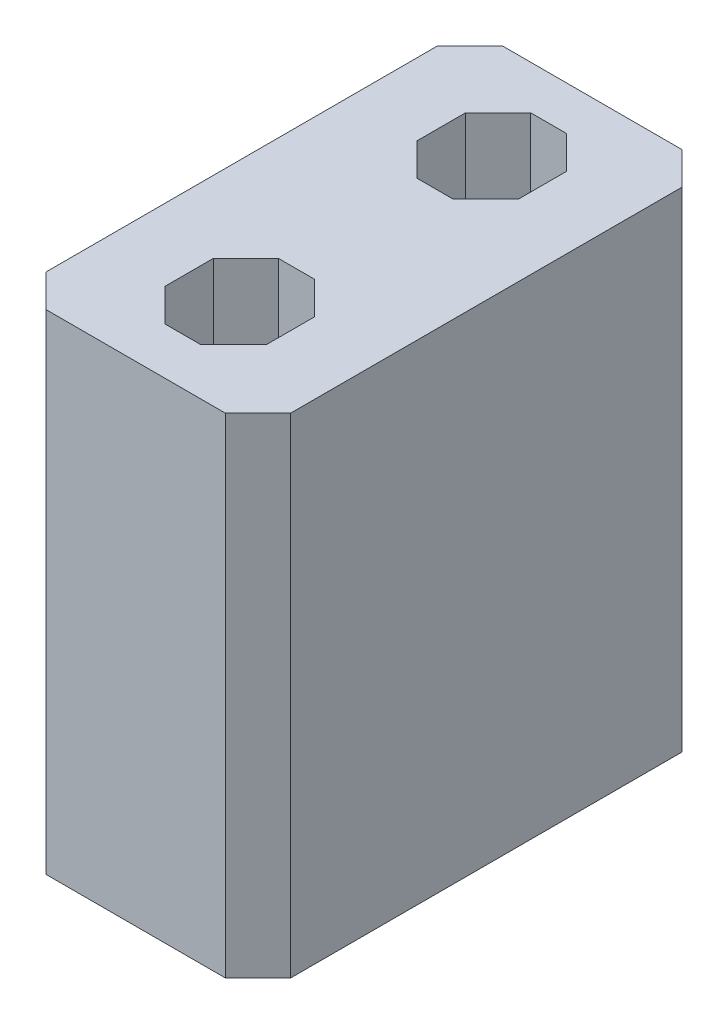
ISO-10303-21;
HEADER;
FILE_DESCRIPTION(('STEP AP214'),'2;1');
FILE_NAME('part.step','',(''),(''),'','','');
FILE_SCHEMA(('AUTOMOTIVE_DESIGN { 1 0 10303 214 1 1 1 1 }'));
ENDSEC;
DATA;
#1=APPLICATION_CONTEXT('core data for automotive mechanical design processes');
#2=APPLICATION_PROTOCOL_DEFINITION('international standard','automotive_design',2000,#1);
#3=PRODUCT_CONTEXT('',#1,'mechanical');
#4=PRODUCT('Part','Part','',(#3));
#5=PRODUCT_RELATED_PRODUCT_CATEGORY('part','',(#4));
#6=PRODUCT_DEFINITION_FORMATION('','',#4);
#7=PRODUCT_DEFINITION_CONTEXT('part definition',#1,'design');
#8=PRODUCT_DEFINITION('design','',#6,#7);
#9=PRODUCT_DEFINITION_SHAPE('','',#8);
#10=(LENGTH_UNIT() NAMED_UNIT(*) SI_UNIT(.MILLI.,.METRE.));
#11=(NAMED_UNIT(*) PLANE_ANGLE_UNIT() SI_UNIT($,.RADIAN.));
#12=(NAMED_UNIT(*) SI_UNIT($,.STERADIAN.) SOLID_ANGLE_UNIT());
#13=UNCERTAINTY_MEASURE_WITH_UNIT(LENGTH_MEASURE(1.E-05),#10,'distance_accuracy_value','');
#14=(GEOMETRIC_REPRESENTATION_CONTEXT(3) GLOBAL_UNCERTAINTY_ASSIGNED_CONTEXT((#13)) GLOBAL_UNIT_ASSIGNED_CONTEXT((#10,
#11,#12)) REPRESENTATION_CONTEXT('',''));
#15=CARTESIAN_POINT('',(0.,0.,0.));
#16=DIRECTION('',(0.,0.,1.));
#17=DIRECTION('',(1.,0.,0.));
#18=AXIS2_PLACEMENT_3D('',#15,#16,#17);
#19=CARTESIAN_POINT('',(0.,0.,0.));
#20=DIRECTION('',(0.,-1.,0.));
#21=DIRECTION('',(0.,0.,-1.));
#22=AXIS2_PLACEMENT_3D('',#19,#20,#21);
#23=PLANE('',#22);
#24=CARTESIAN_POINT('',(0.,0.,-8.));
#25=DIRECTION('',(0.,1.,0.));
#26=DIRECTION('',(0.,0.,1.));
#27=AXIS2_PLACEMENT_3D('',#24,#25,#26);
#28=CIRCLE('',#27,4.);
#29=CARTESIAN_POINT('',(0.,0.,-4.));
#30=VERTEX_POINT('',#29);
#31=EDGE_CURVE('E360',#30,#30,#28,.T.);
#32=ORIENTED_EDGE('',*,*,#31,.T.);
#33=EDGE_LOOP('',(#32));
#34=FACE_BOUND('',#33,.T.);
#35=DIRECTION('',(0.,0.,1.));
#36=VECTOR('',#35,1.);
#37=CARTESIAN_POINT('',(-7.51385015048993,0.,14.098387904848));
#38=LINE('',#37,#36);
#39=CARTESIAN_POINT('',(-7.51385015048993,0.,-11.901612095152));
#40=VERTEX_POINT('',#39);
#41=CARTESIAN_POINT('',(-7.51385015048993,0.,12.098387904848));
#42=VERTEX_POINT('',#41);
#43=EDGE_CURVE('E370',#40,#42,#38,.T.);
#44=ORIENTED_EDGE('',*,*,#43,.F.);
#45=DIRECTION('',(-0.707106781186548,0.,0.707106781186547));
#46=VECTOR('',#45,1.);
#47=CARTESIAN_POINT('',(-9.70773112282095,0.,-9.70773112282096));
#48=LINE('',#47,#46);
#49=CARTESIAN_POINT('',(-5.51385015048992,0.,-13.901612095152));
#50=VERTEX_POINT('',#49);
#51=EDGE_CURVE('E387',#40,#50,#48,.F.);
#52=ORIENTED_EDGE('',*,*,#51,.T.);
#53=DIRECTION('',(-1.,0.,0.));
#54=VECTOR('',#53,1.);
#55=CARTESIAN_POINT('',(-7.51385015048993,0.,-13.901612095152));
#56=LINE('',#55,#54);
#57=CARTESIAN_POINT('',(5.48614984951007,0.,-13.901612095152));
#58=VERTEX_POINT('',#57);
#59=EDGE_CURVE('E367',#58,#50,#56,.T.);
#60=ORIENTED_EDGE('',*,*,#59,.F.);
#61=DIRECTION('',(-0.707106781186547,0.,-0.707106781186548));
#62=VECTOR('',#61,1.);
#63=CARTESIAN_POINT('',(9.69388097233103,0.,-9.69388097233102));
#64=LINE('',#63,#62);
#65=CARTESIAN_POINT('',(7.48614984951007,0.,-11.901612095152));
#66=VERTEX_POINT('',#65);
#67=EDGE_CURVE('E385',#58,#66,#64,.F.);
#68=ORIENTED_EDGE('',*,*,#67,.T.);
#69=DIRECTION('',(0.,0.,-1.));
#70=VECTOR('',#69,1.);
#71=CARTESIAN_POINT('',(7.48614984951007,0.,14.098387904848));
#72=LINE('',#71,#70);
#73=CARTESIAN_POINT('',(7.48614984951007,0.,12.098387904848));
#74=VERTEX_POINT('',#73);
#75=EDGE_CURVE('E365',#74,#66,#72,.T.);
#76=ORIENTED_EDGE('',*,*,#75,.F.);
#77=DIRECTION('',(0.707106781186548,0.,-0.707106781186547));
#78=VECTOR('',#77,1.);
#79=CARTESIAN_POINT('',(9.79226887717904,0.,9.79226887717905));
#80=LINE('',#79,#78);
#81=CARTESIAN_POINT('',(5.48614984951007,0.,14.098387904848));
#82=VERTEX_POINT('',#81);
#83=EDGE_CURVE('E381',#74,#82,#80,.F.);
#84=ORIENTED_EDGE('',*,*,#83,.T.);
#85=DIRECTION('',(1.,0.,0.));
#86=VECTOR('',#85,1.);
#87=CARTESIAN_POINT('',(-7.51385015048993,0.,14.098387904848));
#88=LINE('',#87,#86);
#89=CARTESIAN_POINT('',(-5.51385015048992,0.,14.098387904848));
#90=VERTEX_POINT('',#89);
#91=EDGE_CURVE('E373',#90,#82,#88,.T.);
#92=ORIENTED_EDGE('',*,*,#91,.F.);
#93=DIRECTION('',(0.707106781186547,0.,0.707106781186548));
#94=VECTOR('',#93,1.);
#95=CARTESIAN_POINT('',(-9.80611902766897,0.,9.80611902766895));
#96=LINE('',#95,#94);
#97=EDGE_CURVE('E383',#90,#42,#96,.F.);
#98=ORIENTED_EDGE('',*,*,#97,.T.);
#99=EDGE_LOOP('',(#44,#52,#60,#68,#76,#84,#92,#98));
#100=FACE_BOUND('',#99,.T.);
#101=CARTESIAN_POINT('',(0.,0.,8.));
#102=DIRECTION('',(0.,1.,0.));
#103=DIRECTION('',(0.,0.,-1.));
#104=AXIS2_PLACEMENT_3D('',#101,#102,#103);
#105=CIRCLE('',#104,4.);
#106=CARTESIAN_POINT('',(0.,0.,4.));
#107=VERTEX_POINT('',#106);
#108=EDGE_CURVE('E357',#107,#107,#105,.T.);
#109=ORIENTED_EDGE('',*,*,#108,.T.);
#110=EDGE_LOOP('',(#109));
#111=FACE_BOUND('',#110,.T.);
#112=ADVANCED_FACE('F41',(#34,#100,#111),#23,.T.);
#113=CARTESIAN_POINT('',(7.48614984951007,10.,14.098387904848));
#114=DIRECTION('',(-1.,0.,0.));
#115=DIRECTION('',(0.,0.,1.));
#116=AXIS2_PLACEMENT_3D('',#113,#114,#115);
#117=PLANE('',#116);
#118=ORIENTED_EDGE('',*,*,#75,.T.);
#119=DIRECTION('',(0.,1.,0.));
#120=VECTOR('',#119,1.);
#121=CARTESIAN_POINT('',(7.48614984951007,10.,-11.901612095152));
#122=LINE('',#121,#120);
#123=CARTESIAN_POINT('',(7.48614984951007,30.,-11.901612095152));
#124=VERTEX_POINT('',#123);
#125=EDGE_CURVE('E57',#66,#124,#122,.T.);
#126=ORIENTED_EDGE('',*,*,#125,.T.);
#127=DIRECTION('',(0.,0.,-1.));
#128=VECTOR('',#127,1.);
#129=CARTESIAN_POINT('',(7.48614984951007,30.,-13.901612095152));
#130=LINE('',#129,#128);
#131=CARTESIAN_POINT('',(7.48614984951007,30.,12.098387904848));
#132=VERTEX_POINT('',#131);
#133=EDGE_CURVE('E348',#132,#124,#130,.T.);
#134=ORIENTED_EDGE('',*,*,#133,.F.);
#135=DIRECTION('',(0.,-1.,0.));
#136=VECTOR('',#135,1.);
#137=CARTESIAN_POINT('',(7.48614984951007,10.,12.098387904848));
#138=LINE('',#137,#136);
#139=EDGE_CURVE('E401',#132,#74,#138,.T.);
#140=ORIENTED_EDGE('',*,*,#139,.T.);
#141=EDGE_LOOP('',(#118,#126,#134,#140));
#142=FACE_BOUND('',#141,.T.);
#143=ADVANCED_FACE('F415',(#142),#117,.F.);
#144=CARTESIAN_POINT('',(-7.51385015048993,10.,-13.901612095152));
#145=DIRECTION('',(0.,0.,1.));
#146=DIRECTION('',(1.,0.,0.));
#147=AXIS2_PLACEMENT_3D('',#144,#145,#146);
#148=PLANE('',#147);
#149=ORIENTED_EDGE('',*,*,#59,.T.);
#150=DIRECTION('',(0.,1.,0.));
#151=VECTOR('',#150,1.);
#152=CARTESIAN_POINT('',(-5.51385015048992,10.,-13.901612095152));
#153=LINE('',#152,#151);
#154=CARTESIAN_POINT('',(-5.51385015048992,30.,-13.901612095152));
#155=VERTEX_POINT('',#154);
#156=EDGE_CURVE('E392',#50,#155,#153,.T.);
#157=ORIENTED_EDGE('',*,*,#156,.T.);
#158=DIRECTION('',(-1.,0.,0.));
#159=VECTOR('',#158,1.);
#160=CARTESIAN_POINT('',(-7.51385015048993,30.,-13.901612095152));
#161=LINE('',#160,#159);
#162=CARTESIAN_POINT('',(5.48614984951007,30.,-13.901612095152));
#163=VERTEX_POINT('',#162);
#164=EDGE_CURVE('E350',#163,#155,#161,.T.);
#165=ORIENTED_EDGE('',*,*,#164,.F.);
#166=DIRECTION('',(0.,-1.,0.));
#167=VECTOR('',#166,1.);
#168=CARTESIAN_POINT('',(5.48614984951007,10.,-13.901612095152));
#169=LINE('',#168,#167);
#170=EDGE_CURVE('E389',#163,#58,#169,.T.);
#171=ORIENTED_EDGE('',*,*,#170,.T.);
#172=EDGE_LOOP('',(#149,#157,#165,#171));
#173=FACE_BOUND('',#172,.T.);
#174=ADVANCED_FACE('F426',(#173),#148,.F.);
#175=CARTESIAN_POINT('',(-7.51385015048993,10.,14.098387904848));
#176=DIRECTION('',(1.,0.,0.));
#177=DIRECTION('',(0.,0.,-1.));
#178=AXIS2_PLACEMENT_3D('',#175,#176,#177);
#179=PLANE('',#178);
#180=DIRECTION('',(0.,0.,1.));
#181=VECTOR('',#180,1.);
#182=CARTESIAN_POINT('',(-7.51385015048993,30.,-13.901612095152));
#183=LINE('',#182,#181);
#184=CARTESIAN_POINT('',(-7.51385015048993,30.,-11.901612095152));
#185=VERTEX_POINT('',#184);
#186=CARTESIAN_POINT('',(-7.51385015048993,30.,12.098387904848));
#187=VERTEX_POINT('',#186);
#188=EDGE_CURVE('E269',#185,#187,#183,.T.);
#189=ORIENTED_EDGE('',*,*,#188,.F.);
#190=DIRECTION('',(0.,-1.,0.));
#191=VECTOR('',#190,1.);
#192=CARTESIAN_POINT('',(-7.51385015048993,10.,-11.901612095152));
#193=LINE('',#192,#191);
#194=EDGE_CURVE('E378',#185,#40,#193,.T.);
#195=ORIENTED_EDGE('',*,*,#194,.T.);
#196=ORIENTED_EDGE('',*,*,#43,.T.);
#197=DIRECTION('',(0.,1.,0.));
#198=VECTOR('',#197,1.);
#199=CARTESIAN_POINT('',(-7.51385015048993,10.,12.098387904848));
#200=LINE('',#199,#198);
#201=EDGE_CURVE('E376',#42,#187,#200,.T.);
#202=ORIENTED_EDGE('',*,*,#201,.T.);
#203=EDGE_LOOP('',(#189,#195,#196,#202));
#204=FACE_BOUND('',#203,.T.);
#205=ADVANCED_FACE('F434',(#204),#179,.F.);
#206=CARTESIAN_POINT('',(-7.51385015048993,10.,14.098387904848));
#207=DIRECTION('',(0.,0.,-1.));
#208=DIRECTION('',(-1.,0.,0.));
#209=AXIS2_PLACEMENT_3D('',#206,#207,#208);
#210=PLANE('',#209);
#211=DIRECTION('',(1.,0.,0.));
#212=VECTOR('',#211,1.);
#213=CARTESIAN_POINT('',(-7.51385015048993,30.,14.098387904848));
#214=LINE('',#213,#212);
#215=CARTESIAN_POINT('',(-5.51385015048992,30.,14.098387904848));
#216=VERTEX_POINT('',#215);
#217=CARTESIAN_POINT('',(5.48614984951007,30.,14.098387904848));
#218=VERTEX_POINT('',#217);
#219=EDGE_CURVE('E346',#216,#218,#214,.T.);
#220=ORIENTED_EDGE('',*,*,#219,.F.);
#221=DIRECTION('',(0.,-1.,0.));
#222=VECTOR('',#221,1.);
#223=CARTESIAN_POINT('',(-5.51385015048992,10.,14.098387904848));
#224=LINE('',#223,#222);
#225=EDGE_CURVE('E11',#216,#90,#224,.T.);
#226=ORIENTED_EDGE('',*,*,#225,.T.);
#227=ORIENTED_EDGE('',*,*,#91,.T.);
#228=DIRECTION('',(0.,1.,0.));
#229=VECTOR('',#228,1.);
#230=CARTESIAN_POINT('',(5.48614984951007,10.,14.098387904848));
#231=LINE('',#230,#229);
#232=EDGE_CURVE('E50',#82,#218,#231,.T.);
#233=ORIENTED_EDGE('',*,*,#232,.T.);
#234=EDGE_LOOP('',(#220,#226,#227,#233));
#235=FACE_BOUND('',#234,.T.);
#236=ADVANCED_FACE('F407',(#235),#210,.F.);
#237=CARTESIAN_POINT('',(0.,10.,-8.));
#238=DIRECTION('',(0.,-1.,0.));
#239=DIRECTION('',(0.,0.,-1.));
#240=AXIS2_PLACEMENT_3D('',#237,#238,#239);
#241=CYLINDRICAL_SURFACE('',#240,4.);
#242=CARTESIAN_POINT('',(0.,10.,-8.));
#243=DIRECTION('',(0.,1.,0.));
#244=DIRECTION('',(0.,0.,1.));
#245=AXIS2_PLACEMENT_3D('',#242,#243,#244);
#246=CIRCLE('',#245,4.);
#247=CARTESIAN_POINT('',(0.,10.,-4.));
#248=VERTEX_POINT('',#247);
#249=EDGE_CURVE('E356',#248,#248,#246,.T.);
#250=ORIENTED_EDGE('',*,*,#249,.T.);
#251=EDGE_LOOP('',(#250));
#252=FACE_BOUND('',#251,.T.);
#253=ORIENTED_EDGE('',*,*,#31,.F.);
#254=EDGE_LOOP('',(#253));
#255=FACE_BOUND('',#254,.T.);
#256=ADVANCED_FACE('F455',(#252,#255),#241,.F.);
#257=CARTESIAN_POINT('',(0.,10.,8.));
#258=DIRECTION('',(0.,-1.,0.));
#259=DIRECTION('',(0.,0.,-1.));
#260=AXIS2_PLACEMENT_3D('',#257,#258,#259);
#261=CYLINDRICAL_SURFACE('',#260,4.);
#262=CARTESIAN_POINT('',(0.,10.,8.));
#263=DIRECTION('',(0.,1.,0.));
#264=DIRECTION('',(0.,0.,-1.));
#265=AXIS2_PLACEMENT_3D('',#262,#263,#264);
#266=CIRCLE('',#265,4.);
#267=CARTESIAN_POINT('',(0.,10.,4.));
#268=VERTEX_POINT('',#267);
#269=EDGE_CURVE('E353',#268,#268,#266,.T.);
#270=ORIENTED_EDGE('',*,*,#269,.T.);
#271=EDGE_LOOP('',(#270));
#272=FACE_BOUND('',#271,.T.);
#273=ORIENTED_EDGE('',*,*,#108,.F.);
#274=EDGE_LOOP('',(#273));
#275=FACE_BOUND('',#274,.T.);
#276=ADVANCED_FACE('F551',(#272,#275),#261,.F.);
#277=CARTESIAN_POINT('',(0.,10.,0.));
#278=DIRECTION('',(0.,1.,0.));
#279=DIRECTION('',(0.,0.,1.));
#280=AXIS2_PLACEMENT_3D('',#277,#278,#279);
#281=PLANE('',#280);
#282=ORIENTED_EDGE('',*,*,#269,.F.);
#283=EDGE_LOOP('',(#282));
#284=FACE_BOUND('',#283,.T.);
#285=ADVANCED_FACE('F549',(#284),#281,.F.);
#286=ORIENTED_EDGE('',*,*,#249,.F.);
#287=EDGE_LOOP('',(#286));
#288=FACE_BOUND('',#287,.T.);
#289=ADVANCED_FACE('F546',(#288),#281,.F.);
#290=CARTESIAN_POINT('',(0.,30.,0.));
#291=DIRECTION('',(0.,1.,0.));
#292=DIRECTION('',(0.,0.,1.));
#293=AXIS2_PLACEMENT_3D('',#290,#291,#292);
#294=PLANE('',#293);
#295=DIRECTION('',(-1.,0.,0.));
#296=VECTOR('',#295,1.);
#297=CARTESIAN_POINT('',(-1.10348963632959,30.,-11.2150294184291));
#298=LINE('',#297,#296);
#299=CARTESIAN_POINT('',(1.10348963632959,30.,-11.2150294184291));
#300=VERTEX_POINT('',#299);
#301=CARTESIAN_POINT('',(-1.10348963632959,30.,-11.2150294184291));
#302=VERTEX_POINT('',#301);
#303=EDGE_CURVE('E212',#300,#302,#298,.T.);
#304=ORIENTED_EDGE('',*,*,#303,.F.);
#305=DIRECTION('',(-0.707106781186548,0.,-0.707106781186548));
#306=VECTOR('',#305,1.);
#307=CARTESIAN_POINT('',(1.10348963632959,30.,-11.2150294184291));
#308=LINE('',#307,#306);
#309=CARTESIAN_POINT('',(3.10348963632959,30.,-9.21502941842908));
#310=VERTEX_POINT('',#309);
#311=EDGE_CURVE('E230',#310,#300,#308,.T.);
#312=ORIENTED_EDGE('',*,*,#311,.F.);
#313=DIRECTION('',(0.,0.,-1.));
#314=VECTOR('',#313,1.);
#315=CARTESIAN_POINT('',(3.10348963632959,30.,-9.21502941842908));
#316=LINE('',#315,#314);
#317=CARTESIAN_POINT('',(3.10348963632959,30.,-6.25292645025861));
#318=VERTEX_POINT('',#317);
#319=EDGE_CURVE('E233',#318,#310,#316,.T.);
#320=ORIENTED_EDGE('',*,*,#319,.F.);
#321=DIRECTION('',(0.707106781186548,0.,-0.707106781186548));
#322=VECTOR('',#321,1.);
#323=CARTESIAN_POINT('',(1.10348963632959,30.,-4.25292645025861));
#324=LINE('',#323,#322);
#325=CARTESIAN_POINT('',(1.10348963632959,30.,-4.25292645025861));
#326=VERTEX_POINT('',#325);
#327=EDGE_CURVE('E262',#326,#318,#324,.T.);
#328=ORIENTED_EDGE('',*,*,#327,.F.);
#329=DIRECTION('',(1.,0.,0.));
#330=VECTOR('',#329,1.);
#331=CARTESIAN_POINT('',(-1.10348963632959,30.,-4.25292645025861));
#332=LINE('',#331,#330);
#333=CARTESIAN_POINT('',(-1.10348963632959,30.,-4.25292645025861));
#334=VERTEX_POINT('',#333);
#335=EDGE_CURVE('E259',#334,#326,#332,.T.);
#336=ORIENTED_EDGE('',*,*,#335,.F.);
#337=DIRECTION('',(0.707106781186548,0.,0.707106781186548));
#338=VECTOR('',#337,1.);
#339=CARTESIAN_POINT('',(-3.10348963632959,30.,-6.25292645025861));
#340=LINE('',#339,#338);
#341=CARTESIAN_POINT('',(-3.10348963632959,30.,-6.25292645025861));
#342=VERTEX_POINT('',#341);
#343=EDGE_CURVE('E256',#342,#334,#340,.T.);
#344=ORIENTED_EDGE('',*,*,#343,.F.);
#345=DIRECTION('',(0.,0.,1.));
#346=VECTOR('',#345,1.);
#347=CARTESIAN_POINT('',(-3.10348963632959,30.,-9.21502941842908));
#348=LINE('',#347,#346);
#349=CARTESIAN_POINT('',(-3.10348963632959,30.,-9.21502941842908));
#350=VERTEX_POINT('',#349);
#351=EDGE_CURVE('E253',#350,#342,#348,.T.);
#352=ORIENTED_EDGE('',*,*,#351,.F.);
#353=DIRECTION('',(-0.707106781186548,0.,0.707106781186548));
#354=VECTOR('',#353,1.);
#355=CARTESIAN_POINT('',(-3.10348963632959,30.,-9.21502941842908));
#356=LINE('',#355,#354);
#357=EDGE_CURVE('E250',#302,#350,#356,.T.);
#358=ORIENTED_EDGE('',*,*,#357,.F.);
#359=EDGE_LOOP('',(#304,#312,#320,#328,#336,#344,#352,#358));
#360=FACE_BOUND('',#359,.T.);
#361=DIRECTION('',(-0.707106781186548,0.,0.707106781186548));
#362=VECTOR('',#361,1.);
#363=CARTESIAN_POINT('',(-3.10348963632959,30.,6.25292645025861));
#364=LINE('',#363,#362);
#365=CARTESIAN_POINT('',(-1.10348963632959,30.,4.25292645025861));
#366=VERTEX_POINT('',#365);
#367=CARTESIAN_POINT('',(-3.10348963632959,30.,6.25292645025861));
#368=VERTEX_POINT('',#367);
#369=EDGE_CURVE('E251',#366,#368,#364,.T.);
#370=ORIENTED_EDGE('',*,*,#369,.F.);
#371=DIRECTION('',(-1.,0.,0.));
#372=VECTOR('',#371,1.);
#373=CARTESIAN_POINT('',(-1.10348963632959,30.,4.25292645025861));
#374=LINE('',#373,#372);
#375=CARTESIAN_POINT('',(1.10348963632959,30.,4.25292645025861));
#376=VERTEX_POINT('',#375);
#377=EDGE_CURVE('E299',#376,#366,#374,.T.);
#378=ORIENTED_EDGE('',*,*,#377,.F.);
#379=DIRECTION('',(-0.707106781186548,0.,-0.707106781186548));
#380=VECTOR('',#379,1.);
#381=CARTESIAN_POINT('',(1.10348963632959,30.,4.25292645025861));
#382=LINE('',#381,#380);
#383=CARTESIAN_POINT('',(3.10348963632959,30.,6.25292645025861));
#384=VERTEX_POINT('',#383);
#385=EDGE_CURVE('E302',#384,#376,#382,.T.);
#386=ORIENTED_EDGE('',*,*,#385,.F.);
#387=DIRECTION('',(0.,0.,-1.));
#388=VECTOR('',#387,1.);
#389=CARTESIAN_POINT('',(3.10348963632959,30.,9.21502941842908));
#390=LINE('',#389,#388);
#391=CARTESIAN_POINT('',(3.10348963632959,30.,9.21502941842908));
#392=VERTEX_POINT('',#391);
#393=EDGE_CURVE('E306',#392,#384,#390,.T.);
#394=ORIENTED_EDGE('',*,*,#393,.F.);
#395=DIRECTION('',(0.707106781186548,0.,-0.707106781186548));
#396=VECTOR('',#395,1.);
#397=CARTESIAN_POINT('',(1.10348963632959,30.,11.2150294184291));
#398=LINE('',#397,#396);
#399=CARTESIAN_POINT('',(1.10348963632959,30.,11.2150294184291));
#400=VERTEX_POINT('',#399);
#401=EDGE_CURVE('E309',#400,#392,#398,.T.);
#402=ORIENTED_EDGE('',*,*,#401,.F.);
#403=DIRECTION('',(1.,0.,0.));
#404=VECTOR('',#403,1.);
#405=CARTESIAN_POINT('',(-1.10348963632959,30.,11.2150294184291));
#406=LINE('',#405,#404);
#407=CARTESIAN_POINT('',(-1.10348963632959,30.,11.2150294184291));
#408=VERTEX_POINT('',#407);
#409=EDGE_CURVE('E312',#408,#400,#406,.T.);
#410=ORIENTED_EDGE('',*,*,#409,.F.);
#411=DIRECTION('',(0.707106781186548,0.,0.707106781186548));
#412=VECTOR('',#411,1.);
#413=CARTESIAN_POINT('',(-3.10348963632959,30.,9.21502941842908));
#414=LINE('',#413,#412);
#415=CARTESIAN_POINT('',(-3.10348963632959,30.,9.21502941842908));
#416=VERTEX_POINT('',#415);
#417=EDGE_CURVE('E315',#416,#408,#414,.T.);
#418=ORIENTED_EDGE('',*,*,#417,.F.);
#419=DIRECTION('',(0.,0.,1.));
#420=VECTOR('',#419,1.);
#421=CARTESIAN_POINT('',(-3.10348963632959,30.,9.21502941842908));
#422=LINE('',#421,#420);
#423=EDGE_CURVE('E318',#368,#416,#422,.T.);
#424=ORIENTED_EDGE('',*,*,#423,.F.);
#425=EDGE_LOOP('',(#370,#378,#386,#394,#402,#410,#418,#424));
#426=FACE_BOUND('',#425,.T.);
#427=ORIENTED_EDGE('',*,*,#164,.T.);
#428=DIRECTION('',(0.707106781186548,0.,-0.707106781186547));
#429=VECTOR('',#428,1.);
#430=CARTESIAN_POINT('',(-9.70773112282095,30.,-9.70773112282096));
#431=LINE('',#430,#429);
#432=EDGE_CURVE('E399',#155,#185,#431,.F.);
#433=ORIENTED_EDGE('',*,*,#432,.T.);
#434=ORIENTED_EDGE('',*,*,#188,.T.);
#435=DIRECTION('',(-0.707106781186547,0.,-0.707106781186548));
#436=VECTOR('',#435,1.);
#437=CARTESIAN_POINT('',(-9.80611902766897,30.,9.80611902766895));
#438=LINE('',#437,#436);
#439=EDGE_CURVE('E395',#187,#216,#438,.F.);
#440=ORIENTED_EDGE('',*,*,#439,.T.);
#441=ORIENTED_EDGE('',*,*,#219,.T.);
#442=DIRECTION('',(-0.707106781186548,0.,0.707106781186547));
#443=VECTOR('',#442,1.);
#444=CARTESIAN_POINT('',(9.79226887717904,30.,9.79226887717905));
#445=LINE('',#444,#443);
#446=EDGE_CURVE('E64',#218,#132,#445,.F.);
#447=ORIENTED_EDGE('',*,*,#446,.T.);
#448=ORIENTED_EDGE('',*,*,#133,.T.);
#449=DIRECTION('',(0.707106781186547,0.,0.707106781186548));
#450=VECTOR('',#449,1.);
#451=CARTESIAN_POINT('',(9.69388097233103,30.,-9.69388097233102));
#452=LINE('',#451,#450);
#453=EDGE_CURVE('E397',#124,#163,#452,.F.);
#454=ORIENTED_EDGE('',*,*,#453,.T.);
#455=EDGE_LOOP('',(#427,#433,#434,#440,#441,#447,#448,#454));
#456=FACE_BOUND('',#455,.T.);
#457=ADVANCED_FACE('F411',(#360,#426,#456),#294,.T.);
#458=CARTESIAN_POINT('',(-3.10348963632959,15.,6.25292645025861));
#459=DIRECTION('',(-0.707106781186547,0.,-0.707106781186547));
#460=DIRECTION('',(-0.707106781186548,0.,0.707106781186548));
#461=AXIS2_PLACEMENT_3D('',#458,#459,#460);
#462=PLANE('',#461);
#463=ORIENTED_EDGE('',*,*,#369,.T.);
#464=DIRECTION('',(0.,1.,0.));
#465=VECTOR('',#464,1.);
#466=CARTESIAN_POINT('',(-3.10348963632959,15.,6.25292645025861));
#467=LINE('',#466,#465);
#468=CARTESIAN_POINT('',(-3.10348963632959,15.,6.25292645025861));
#469=VERTEX_POINT('',#468);
#470=EDGE_CURVE('E281',#469,#368,#467,.T.);
#471=ORIENTED_EDGE('',*,*,#470,.F.);
#472=DIRECTION('',(-0.707106781186548,0.,0.707106781186548));
#473=VECTOR('',#472,1.);
#474=CARTESIAN_POINT('',(-3.10348963632959,15.,6.25292645025861));
#475=LINE('',#474,#473);
#476=CARTESIAN_POINT('',(-1.10348963632959,15.,4.25292645025861));
#477=VERTEX_POINT('',#476);
#478=EDGE_CURVE('E303',#477,#469,#475,.T.);
#479=ORIENTED_EDGE('',*,*,#478,.F.);
#480=DIRECTION('',(0.,1.,0.));
#481=VECTOR('',#480,1.);
#482=CARTESIAN_POINT('',(-1.10348963632959,15.,4.25292645025861));
#483=LINE('',#482,#481);
#484=EDGE_CURVE('E297',#477,#366,#483,.T.);
#485=ORIENTED_EDGE('',*,*,#484,.T.);
#486=EDGE_LOOP('',(#463,#471,#479,#485));
#487=FACE_BOUND('',#486,.T.);
#488=ADVANCED_FACE('F510',(#487),#462,.F.);
#489=CARTESIAN_POINT('',(-1.10348963632959,15.,4.25292645025861));
#490=DIRECTION('',(0.,0.,-1.));
#491=DIRECTION('',(-1.,0.,0.));
#492=AXIS2_PLACEMENT_3D('',#489,#490,#491);
#493=PLANE('',#492);
#494=ORIENTED_EDGE('',*,*,#377,.T.);
#495=ORIENTED_EDGE('',*,*,#484,.F.);
#496=DIRECTION('',(-1.,0.,0.));
#497=VECTOR('',#496,1.);
#498=CARTESIAN_POINT('',(-1.10348963632959,15.,4.25292645025861));
#499=LINE('',#498,#497);
#500=CARTESIAN_POINT('',(1.10348963632959,15.,4.25292645025861));
#501=VERTEX_POINT('',#500);
#502=EDGE_CURVE('E284',#501,#477,#499,.T.);
#503=ORIENTED_EDGE('',*,*,#502,.F.);
#504=DIRECTION('',(0.,1.,0.));
#505=VECTOR('',#504,1.);
#506=CARTESIAN_POINT('',(1.10348963632959,15.,4.25292645025861));
#507=LINE('',#506,#505);
#508=EDGE_CURVE('E295',#501,#376,#507,.T.);
#509=ORIENTED_EDGE('',*,*,#508,.T.);
#510=EDGE_LOOP('',(#494,#495,#503,#509));
#511=FACE_BOUND('',#510,.T.);
#512=ADVANCED_FACE('F513',(#511),#493,.F.);
#513=CARTESIAN_POINT('',(1.10348963632959,15.,4.25292645025861));
#514=DIRECTION('',(0.707106781186547,0.,-0.707106781186547));
#515=DIRECTION('',(-0.707106781186548,0.,-0.707106781186548));
#516=AXIS2_PLACEMENT_3D('',#513,#514,#515);
#517=PLANE('',#516);
#518=ORIENTED_EDGE('',*,*,#385,.T.);
#519=ORIENTED_EDGE('',*,*,#508,.F.);
#520=DIRECTION('',(-0.707106781186548,0.,-0.707106781186548));
#521=VECTOR('',#520,1.);
#522=CARTESIAN_POINT('',(1.10348963632959,15.,4.25292645025861));
#523=LINE('',#522,#521);
#524=CARTESIAN_POINT('',(3.10348963632959,15.,6.25292645025861));
#525=VERTEX_POINT('',#524);
#526=EDGE_CURVE('E324',#525,#501,#523,.T.);
#527=ORIENTED_EDGE('',*,*,#526,.F.);
#528=DIRECTION('',(0.,1.,0.));
#529=VECTOR('',#528,1.);
#530=CARTESIAN_POINT('',(3.10348963632959,15.,6.25292645025861));
#531=LINE('',#530,#529);
#532=EDGE_CURVE('E293',#525,#384,#531,.T.);
#533=ORIENTED_EDGE('',*,*,#532,.T.);
#534=EDGE_LOOP('',(#518,#519,#527,#533));
#535=FACE_BOUND('',#534,.T.);
#536=ADVANCED_FACE('F534',(#535),#517,.F.);
#537=CARTESIAN_POINT('',(3.10348963632959,15.,9.21502941842908));
#538=DIRECTION('',(1.,0.,0.));
#539=DIRECTION('',(0.,0.,-1.));
#540=AXIS2_PLACEMENT_3D('',#537,#538,#539);
#541=PLANE('',#540);
#542=ORIENTED_EDGE('',*,*,#393,.T.);
#543=ORIENTED_EDGE('',*,*,#532,.F.);
#544=DIRECTION('',(0.,0.,-1.));
#545=VECTOR('',#544,1.);
#546=CARTESIAN_POINT('',(3.10348963632959,15.,9.21502941842908));
#547=LINE('',#546,#545);
#548=CARTESIAN_POINT('',(3.10348963632959,15.,9.21502941842908));
#549=VERTEX_POINT('',#548);
#550=EDGE_CURVE('E327',#549,#525,#547,.T.);
#551=ORIENTED_EDGE('',*,*,#550,.F.);
#552=DIRECTION('',(0.,1.,0.));
#553=VECTOR('',#552,1.);
#554=CARTESIAN_POINT('',(3.10348963632959,15.,9.21502941842908));
#555=LINE('',#554,#553);
#556=EDGE_CURVE('E291',#549,#392,#555,.T.);
#557=ORIENTED_EDGE('',*,*,#556,.T.);
#558=EDGE_LOOP('',(#542,#543,#551,#557));
#559=FACE_BOUND('',#558,.T.);
#560=ADVANCED_FACE('F530',(#559),#541,.F.);
#561=CARTESIAN_POINT('',(1.10348963632959,15.,11.2150294184291));
#562=DIRECTION('',(0.707106781186547,0.,0.707106781186547));
#563=DIRECTION('',(0.707106781186548,0.,-0.707106781186548));
#564=AXIS2_PLACEMENT_3D('',#561,#562,#563);
#565=PLANE('',#564);
#566=ORIENTED_EDGE('',*,*,#401,.T.);
#567=ORIENTED_EDGE('',*,*,#556,.F.);
#568=DIRECTION('',(0.707106781186548,0.,-0.707106781186548));
#569=VECTOR('',#568,1.);
#570=CARTESIAN_POINT('',(1.10348963632959,15.,11.2150294184291));
#571=LINE('',#570,#569);
#572=CARTESIAN_POINT('',(1.10348963632959,15.,11.2150294184291));
#573=VERTEX_POINT('',#572);
#574=EDGE_CURVE('E330',#573,#549,#571,.T.);
#575=ORIENTED_EDGE('',*,*,#574,.F.);
#576=DIRECTION('',(0.,1.,0.));
#577=VECTOR('',#576,1.);
#578=CARTESIAN_POINT('',(1.10348963632959,15.,11.2150294184291));
#579=LINE('',#578,#577);
#580=EDGE_CURVE('E289',#573,#400,#579,.T.);
#581=ORIENTED_EDGE('',*,*,#580,.T.);
#582=EDGE_LOOP('',(#566,#567,#575,#581));
#583=FACE_BOUND('',#582,.T.);
#584=ADVANCED_FACE('F526',(#583),#565,.F.);
#585=CARTESIAN_POINT('',(-1.10348963632959,15.,11.2150294184291));
#586=DIRECTION('',(0.,0.,1.));
#587=DIRECTION('',(1.,0.,0.));
#588=AXIS2_PLACEMENT_3D('',#585,#586,#587);
#589=PLANE('',#588);
#590=ORIENTED_EDGE('',*,*,#409,.T.);
#591=ORIENTED_EDGE('',*,*,#580,.F.);
#592=DIRECTION('',(1.,0.,0.));
#593=VECTOR('',#592,1.);
#594=CARTESIAN_POINT('',(-1.10348963632959,15.,11.2150294184291));
#595=LINE('',#594,#593);
#596=CARTESIAN_POINT('',(-1.10348963632959,15.,11.2150294184291));
#597=VERTEX_POINT('',#596);
#598=EDGE_CURVE('E333',#597,#573,#595,.T.);
#599=ORIENTED_EDGE('',*,*,#598,.F.);
#600=DIRECTION('',(0.,1.,0.));
#601=VECTOR('',#600,1.);
#602=CARTESIAN_POINT('',(-1.10348963632959,15.,11.2150294184291));
#603=LINE('',#602,#601);
#604=EDGE_CURVE('E287',#597,#408,#603,.T.);
#605=ORIENTED_EDGE('',*,*,#604,.T.);
#606=EDGE_LOOP('',(#590,#591,#599,#605));
#607=FACE_BOUND('',#606,.T.);
#608=ADVANCED_FACE('F522',(#607),#589,.F.);
#609=CARTESIAN_POINT('',(-3.10348963632959,15.,9.21502941842908));
#610=DIRECTION('',(-0.707106781186547,0.,0.707106781186547));
#611=DIRECTION('',(0.707106781186548,0.,0.707106781186548));
#612=AXIS2_PLACEMENT_3D('',#609,#610,#611);
#613=PLANE('',#612);
#614=ORIENTED_EDGE('',*,*,#417,.T.);
#615=ORIENTED_EDGE('',*,*,#604,.F.);
#616=DIRECTION('',(0.707106781186548,0.,0.707106781186548));
#617=VECTOR('',#616,1.);
#618=CARTESIAN_POINT('',(-3.10348963632959,15.,9.21502941842908));
#619=LINE('',#618,#617);
#620=CARTESIAN_POINT('',(-3.10348963632959,15.,9.21502941842908));
#621=VERTEX_POINT('',#620);
#622=EDGE_CURVE('E336',#621,#597,#619,.T.);
#623=ORIENTED_EDGE('',*,*,#622,.F.);
#624=DIRECTION('',(0.,1.,0.));
#625=VECTOR('',#624,1.);
#626=CARTESIAN_POINT('',(-3.10348963632959,15.,9.21502941842908));
#627=LINE('',#626,#625);
#628=EDGE_CURVE('E285',#621,#416,#627,.T.);
#629=ORIENTED_EDGE('',*,*,#628,.T.);
#630=EDGE_LOOP('',(#614,#615,#623,#629));
#631=FACE_BOUND('',#630,.T.);
#632=ADVANCED_FACE('F518',(#631),#613,.F.);
#633=CARTESIAN_POINT('',(-3.10348963632959,15.,9.21502941842908));
#634=DIRECTION('',(-1.,0.,0.));
#635=DIRECTION('',(0.,0.,1.));
#636=AXIS2_PLACEMENT_3D('',#633,#634,#635);
#637=PLANE('',#636);
#638=ORIENTED_EDGE('',*,*,#423,.T.);
#639=ORIENTED_EDGE('',*,*,#628,.F.);
#640=DIRECTION('',(0.,0.,1.));
#641=VECTOR('',#640,1.);
#642=CARTESIAN_POINT('',(-3.10348963632959,15.,9.21502941842908));
#643=LINE('',#642,#641);
#644=EDGE_CURVE('E339',#469,#621,#643,.T.);
#645=ORIENTED_EDGE('',*,*,#644,.F.);
#646=ORIENTED_EDGE('',*,*,#470,.T.);
#647=EDGE_LOOP('',(#638,#639,#645,#646));
#648=FACE_BOUND('',#647,.T.);
#649=ADVANCED_FACE('F515',(#648),#637,.F.);
#650=CARTESIAN_POINT('',(0.,15.,0.));
#651=DIRECTION('',(0.,-1.,0.));
#652=DIRECTION('',(0.,0.,-1.));
#653=AXIS2_PLACEMENT_3D('',#650,#651,#652);
#654=PLANE('',#653);
#655=ORIENTED_EDGE('',*,*,#478,.T.);
#656=ORIENTED_EDGE('',*,*,#644,.T.);
#657=ORIENTED_EDGE('',*,*,#622,.T.);
#658=ORIENTED_EDGE('',*,*,#598,.T.);
#659=ORIENTED_EDGE('',*,*,#574,.T.);
#660=ORIENTED_EDGE('',*,*,#550,.T.);
#661=ORIENTED_EDGE('',*,*,#526,.T.);
#662=ORIENTED_EDGE('',*,*,#502,.T.);
#663=EDGE_LOOP('',(#655,#656,#657,#658,#659,#660,#661,#662));
#664=FACE_BOUND('',#663,.T.);
#665=ADVANCED_FACE('F509',(#664),#654,.F.);
#666=CARTESIAN_POINT('',(-1.10348963632959,15.,-11.2150294184291));
#667=DIRECTION('',(0.,0.,-1.));
#668=DIRECTION('',(-1.,0.,0.));
#669=AXIS2_PLACEMENT_3D('',#666,#667,#668);
#670=PLANE('',#669);
#671=ORIENTED_EDGE('',*,*,#303,.T.);
#672=DIRECTION('',(0.,1.,0.));
#673=VECTOR('',#672,1.);
#674=CARTESIAN_POINT('',(-1.10348963632959,15.,-11.2150294184291));
#675=LINE('',#674,#673);
#676=CARTESIAN_POINT('',(-1.10348963632959,15.,-11.2150294184291));
#677=VERTEX_POINT('',#676);
#678=EDGE_CURVE('E205',#677,#302,#675,.T.);
#679=ORIENTED_EDGE('',*,*,#678,.F.);
#680=DIRECTION('',(-1.,0.,0.));
#681=VECTOR('',#680,1.);
#682=CARTESIAN_POINT('',(-1.10348963632959,15.,-11.2150294184291));
#683=LINE('',#682,#681);
#684=CARTESIAN_POINT('',(1.10348963632959,15.,-11.2150294184291));
#685=VERTEX_POINT('',#684);
#686=EDGE_CURVE('E209',#685,#677,#683,.T.);
#687=ORIENTED_EDGE('',*,*,#686,.F.);
#688=DIRECTION('',(0.,1.,0.));
#689=VECTOR('',#688,1.);
#690=CARTESIAN_POINT('',(1.10348963632959,15.,-11.2150294184291));
#691=LINE('',#690,#689);
#692=EDGE_CURVE('E267',#685,#300,#691,.T.);
#693=ORIENTED_EDGE('',*,*,#692,.T.);
#694=EDGE_LOOP('',(#671,#679,#687,#693));
#695=FACE_BOUND('',#694,.T.);
#696=ADVANCED_FACE('F207',(#695),#670,.F.);
#697=CARTESIAN_POINT('',(1.10348963632959,15.,-11.2150294184291));
#698=DIRECTION('',(0.707106781186547,0.,-0.707106781186547));
#699=DIRECTION('',(-0.707106781186548,0.,-0.707106781186548));
#700=AXIS2_PLACEMENT_3D('',#697,#698,#699);
#701=PLANE('',#700);
#702=ORIENTED_EDGE('',*,*,#311,.T.);
#703=ORIENTED_EDGE('',*,*,#692,.F.);
#704=DIRECTION('',(-0.707106781186548,0.,-0.707106781186548));
#705=VECTOR('',#704,1.);
#706=CARTESIAN_POINT('',(1.10348963632959,15.,-11.2150294184291));
#707=LINE('',#706,#705);
#708=CARTESIAN_POINT('',(3.10348963632959,15.,-9.21502941842908));
#709=VERTEX_POINT('',#708);
#710=EDGE_CURVE('E217',#709,#685,#707,.T.);
#711=ORIENTED_EDGE('',*,*,#710,.F.);
#712=DIRECTION('',(0.,1.,0.));
#713=VECTOR('',#712,1.);
#714=CARTESIAN_POINT('',(3.10348963632959,15.,-9.21502941842908));
#715=LINE('',#714,#713);
#716=EDGE_CURVE('E270',#709,#310,#715,.T.);
#717=ORIENTED_EDGE('',*,*,#716,.T.);
#718=EDGE_LOOP('',(#702,#703,#711,#717));
#719=FACE_BOUND('',#718,.T.);
#720=ADVANCED_FACE('F484',(#719),#701,.F.);
#721=CARTESIAN_POINT('',(3.10348963632959,15.,-9.21502941842908));
#722=DIRECTION('',(1.,0.,0.));
#723=DIRECTION('',(0.,0.,-1.));
#724=AXIS2_PLACEMENT_3D('',#721,#722,#723);
#725=PLANE('',#724);
#726=ORIENTED_EDGE('',*,*,#319,.T.);
#727=ORIENTED_EDGE('',*,*,#716,.F.);
#728=DIRECTION('',(0.,0.,-1.));
#729=VECTOR('',#728,1.);
#730=CARTESIAN_POINT('',(3.10348963632959,15.,-9.21502941842908));
#731=LINE('',#730,#729);
#732=CARTESIAN_POINT('',(3.10348963632959,15.,-6.25292645025861));
#733=VERTEX_POINT('',#732);
#734=EDGE_CURVE('E246',#733,#709,#731,.T.);
#735=ORIENTED_EDGE('',*,*,#734,.F.);
#736=DIRECTION('',(0.,1.,0.));
#737=VECTOR('',#736,1.);
#738=CARTESIAN_POINT('',(3.10348963632959,15.,-6.25292645025861));
#739=LINE('',#738,#737);
#740=EDGE_CURVE('E272',#733,#318,#739,.T.);
#741=ORIENTED_EDGE('',*,*,#740,.T.);
#742=EDGE_LOOP('',(#726,#727,#735,#741));
#743=FACE_BOUND('',#742,.T.);
#744=ADVANCED_FACE('F487',(#743),#725,.F.);
#745=CARTESIAN_POINT('',(1.10348963632959,15.,-4.25292645025861));
#746=DIRECTION('',(0.707106781186547,0.,0.707106781186547));
#747=DIRECTION('',(0.707106781186548,0.,-0.707106781186548));
#748=AXIS2_PLACEMENT_3D('',#745,#746,#747);
#749=PLANE('',#748);
#750=ORIENTED_EDGE('',*,*,#327,.T.);
#751=ORIENTED_EDGE('',*,*,#740,.F.);
#752=DIRECTION('',(0.707106781186548,0.,-0.707106781186548));
#753=VECTOR('',#752,1.);
#754=CARTESIAN_POINT('',(1.10348963632959,15.,-4.25292645025861));
#755=LINE('',#754,#753);
#756=CARTESIAN_POINT('',(1.10348963632959,15.,-4.25292645025861));
#757=VERTEX_POINT('',#756);
#758=EDGE_CURVE('E243',#757,#733,#755,.T.);
#759=ORIENTED_EDGE('',*,*,#758,.F.);
#760=DIRECTION('',(0.,1.,0.));
#761=VECTOR('',#760,1.);
#762=CARTESIAN_POINT('',(1.10348963632959,15.,-4.25292645025861));
#763=LINE('',#762,#761);
#764=EDGE_CURVE('E274',#757,#326,#763,.T.);
#765=ORIENTED_EDGE('',*,*,#764,.T.);
#766=EDGE_LOOP('',(#750,#751,#759,#765));
#767=FACE_BOUND('',#766,.T.);
#768=ADVANCED_FACE('F491',(#767),#749,.F.);
#769=CARTESIAN_POINT('',(-1.10348963632959,15.,-4.25292645025861));
#770=DIRECTION('',(0.,0.,1.));
#771=DIRECTION('',(1.,0.,0.));
#772=AXIS2_PLACEMENT_3D('',#769,#770,#771);
#773=PLANE('',#772);
#774=ORIENTED_EDGE('',*,*,#335,.T.);
#775=ORIENTED_EDGE('',*,*,#764,.F.);
#776=DIRECTION('',(1.,0.,0.));
#777=VECTOR('',#776,1.);
#778=CARTESIAN_POINT('',(-1.10348963632959,15.,-4.25292645025861));
#779=LINE('',#778,#777);
#780=CARTESIAN_POINT('',(-1.10348963632959,15.,-4.25292645025861));
#781=VERTEX_POINT('',#780);
#782=EDGE_CURVE('E240',#781,#757,#779,.T.);
#783=ORIENTED_EDGE('',*,*,#782,.F.);
#784=DIRECTION('',(0.,1.,0.));
#785=VECTOR('',#784,1.);
#786=CARTESIAN_POINT('',(-1.10348963632959,15.,-4.25292645025861));
#787=LINE('',#786,#785);
#788=EDGE_CURVE('E276',#781,#334,#787,.T.);
#789=ORIENTED_EDGE('',*,*,#788,.T.);
#790=EDGE_LOOP('',(#774,#775,#783,#789));
#791=FACE_BOUND('',#790,.T.);
#792=ADVANCED_FACE('F495',(#791),#773,.F.);
#793=CARTESIAN_POINT('',(-3.10348963632959,15.,-6.25292645025861));
#794=DIRECTION('',(-0.707106781186547,0.,0.707106781186547));
#795=DIRECTION('',(0.707106781186548,0.,0.707106781186548));
#796=AXIS2_PLACEMENT_3D('',#793,#794,#795);
#797=PLANE('',#796);
#798=ORIENTED_EDGE('',*,*,#343,.T.);
#799=ORIENTED_EDGE('',*,*,#788,.F.);
#800=DIRECTION('',(0.707106781186548,0.,0.707106781186548));
#801=VECTOR('',#800,1.);
#802=CARTESIAN_POINT('',(-3.10348963632959,15.,-6.25292645025861));
#803=LINE('',#802,#801);
#804=CARTESIAN_POINT('',(-3.10348963632959,15.,-6.25292645025861));
#805=VERTEX_POINT('',#804);
#806=EDGE_CURVE('E237',#805,#781,#803,.T.);
#807=ORIENTED_EDGE('',*,*,#806,.F.);
#808=DIRECTION('',(0.,1.,0.));
#809=VECTOR('',#808,1.);
#810=CARTESIAN_POINT('',(-3.10348963632959,15.,-6.25292645025861));
#811=LINE('',#810,#809);
#812=EDGE_CURVE('E278',#805,#342,#811,.T.);
#813=ORIENTED_EDGE('',*,*,#812,.T.);
#814=EDGE_LOOP('',(#798,#799,#807,#813));
#815=FACE_BOUND('',#814,.T.);
#816=ADVANCED_FACE('F499',(#815),#797,.F.);
#817=CARTESIAN_POINT('',(-3.10348963632959,15.,-9.21502941842908));
#818=DIRECTION('',(-1.,0.,0.));
#819=DIRECTION('',(0.,0.,1.));
#820=AXIS2_PLACEMENT_3D('',#817,#818,#819);
#821=PLANE('',#820);
#822=ORIENTED_EDGE('',*,*,#351,.T.);
#823=ORIENTED_EDGE('',*,*,#812,.F.);
#824=DIRECTION('',(0.,0.,1.));
#825=VECTOR('',#824,1.);
#826=CARTESIAN_POINT('',(-3.10348963632959,15.,-9.21502941842908));
#827=LINE('',#826,#825);
#828=CARTESIAN_POINT('',(-3.10348963632959,15.,-9.21502941842908));
#829=VERTEX_POINT('',#828);
#830=EDGE_CURVE('E225',#829,#805,#827,.T.);
#831=ORIENTED_EDGE('',*,*,#830,.F.);
#832=DIRECTION('',(0.,1.,0.));
#833=VECTOR('',#832,1.);
#834=CARTESIAN_POINT('',(-3.10348963632959,15.,-9.21502941842908));
#835=LINE('',#834,#833);
#836=EDGE_CURVE('E216',#829,#350,#835,.T.);
#837=ORIENTED_EDGE('',*,*,#836,.T.);
#838=EDGE_LOOP('',(#822,#823,#831,#837));
#839=FACE_BOUND('',#838,.T.);
#840=ADVANCED_FACE('F481',(#839),#821,.F.);
#841=CARTESIAN_POINT('',(-3.10348963632959,15.,-9.21502941842908));
#842=DIRECTION('',(-0.707106781186547,0.,-0.707106781186547));
#843=DIRECTION('',(-0.707106781186548,0.,0.707106781186548));
#844=AXIS2_PLACEMENT_3D('',#841,#842,#843);
#845=PLANE('',#844);
#846=ORIENTED_EDGE('',*,*,#357,.T.);
#847=ORIENTED_EDGE('',*,*,#836,.F.);
#848=DIRECTION('',(-0.707106781186548,0.,0.707106781186548));
#849=VECTOR('',#848,1.);
#850=CARTESIAN_POINT('',(-3.10348963632959,15.,-9.21502941842908));
#851=LINE('',#850,#849);
#852=EDGE_CURVE('E220',#677,#829,#851,.T.);
#853=ORIENTED_EDGE('',*,*,#852,.F.);
#854=ORIENTED_EDGE('',*,*,#678,.T.);
#855=EDGE_LOOP('',(#846,#847,#853,#854));
#856=FACE_BOUND('',#855,.T.);
#857=ADVANCED_FACE('F221',(#856),#845,.F.);
#858=CARTESIAN_POINT('',(0.,15.,0.));
#859=DIRECTION('',(0.,-1.,0.));
#860=DIRECTION('',(0.,0.,-1.));
#861=AXIS2_PLACEMENT_3D('',#858,#859,#860);
#862=PLANE('',#861);
#863=ORIENTED_EDGE('',*,*,#686,.T.);
#864=ORIENTED_EDGE('',*,*,#852,.T.);
#865=ORIENTED_EDGE('',*,*,#830,.T.);
#866=ORIENTED_EDGE('',*,*,#806,.T.);
#867=ORIENTED_EDGE('',*,*,#782,.T.);
#868=ORIENTED_EDGE('',*,*,#758,.T.);
#869=ORIENTED_EDGE('',*,*,#734,.T.);
#870=ORIENTED_EDGE('',*,*,#710,.T.);
#871=EDGE_LOOP('',(#863,#864,#865,#866,#867,#868,#869,#870));
#872=FACE_BOUND('',#871,.T.);
#873=ADVANCED_FACE('F227',(#872),#862,.F.);
#874=CARTESIAN_POINT('',(-7.51385015048993,10.,-11.901612095152));
#875=DIRECTION('',(0.707106781186547,0.,0.707106781186548));
#876=DIRECTION('',(0.,-1.,0.));
#877=AXIS2_PLACEMENT_3D('',#874,#875,#876);
#878=PLANE('',#877);
#879=ORIENTED_EDGE('',*,*,#432,.F.);
#880=ORIENTED_EDGE('',*,*,#156,.F.);
#881=ORIENTED_EDGE('',*,*,#51,.F.);
#882=ORIENTED_EDGE('',*,*,#194,.F.);
#883=EDGE_LOOP('',(#879,#880,#881,#882));
#884=FACE_BOUND('',#883,.T.);
#885=ADVANCED_FACE('F432',(#884),#878,.F.);
#886=CARTESIAN_POINT('',(5.48614984951007,10.,-13.901612095152));
#887=DIRECTION('',(-0.707106781186548,0.,0.707106781186547));
#888=DIRECTION('',(0.,-1.,0.));
#889=AXIS2_PLACEMENT_3D('',#886,#887,#888);
#890=PLANE('',#889);
#891=ORIENTED_EDGE('',*,*,#453,.F.);
#892=ORIENTED_EDGE('',*,*,#125,.F.);
#893=ORIENTED_EDGE('',*,*,#67,.F.);
#894=ORIENTED_EDGE('',*,*,#170,.F.);
#895=EDGE_LOOP('',(#891,#892,#893,#894));
#896=FACE_BOUND('',#895,.T.);
#897=ADVANCED_FACE('F423',(#896),#890,.F.);
#898=CARTESIAN_POINT('',(-5.51385015048992,10.,14.098387904848));
#899=DIRECTION('',(0.707106781186548,0.,-0.707106781186547));
#900=DIRECTION('',(0.,-1.,0.));
#901=AXIS2_PLACEMENT_3D('',#898,#899,#900);
#902=PLANE('',#901);
#903=ORIENTED_EDGE('',*,*,#439,.F.);
#904=ORIENTED_EDGE('',*,*,#201,.F.);
#905=ORIENTED_EDGE('',*,*,#97,.F.);
#906=ORIENTED_EDGE('',*,*,#225,.F.);
#907=EDGE_LOOP('',(#903,#904,#905,#906));
#908=FACE_BOUND('',#907,.T.);
#909=ADVANCED_FACE('F437',(#908),#902,.F.);
#910=CARTESIAN_POINT('',(7.48614984951007,10.,12.098387904848));
#911=DIRECTION('',(-0.707106781186547,0.,-0.707106781186548));
#912=DIRECTION('',(0.,-1.,0.));
#913=AXIS2_PLACEMENT_3D('',#910,#911,#912);
#914=PLANE('',#913);
#915=ORIENTED_EDGE('',*,*,#446,.F.);
#916=ORIENTED_EDGE('',*,*,#232,.F.);
#917=ORIENTED_EDGE('',*,*,#83,.F.);
#918=ORIENTED_EDGE('',*,*,#139,.F.);
#919=EDGE_LOOP('',(#915,#916,#917,#918));
#920=FACE_BOUND('',#919,.T.);
#921=ADVANCED_FACE('F44',(#920),#914,.F.);
#922=CLOSED_SHELL('',(#112,#143,#174,#205,#236,#256,#276,#285,#289,#457,#488,#512,#536,#560,
#584,#608,#632,#649,#665,#696,#720,#744,#768,#792,#816,#840,#857,#873,#885,#897,#909,#921));
#923=MANIFOLD_SOLID_BREP('B2',#922);
#924=ADVANCED_BREP_SHAPE_REPRESENTATION('',(#18,#923),#14);
#925=SHAPE_DEFINITION_REPRESENTATION(#9,#924);
ENDSEC;
END-ISO-10303-21;
